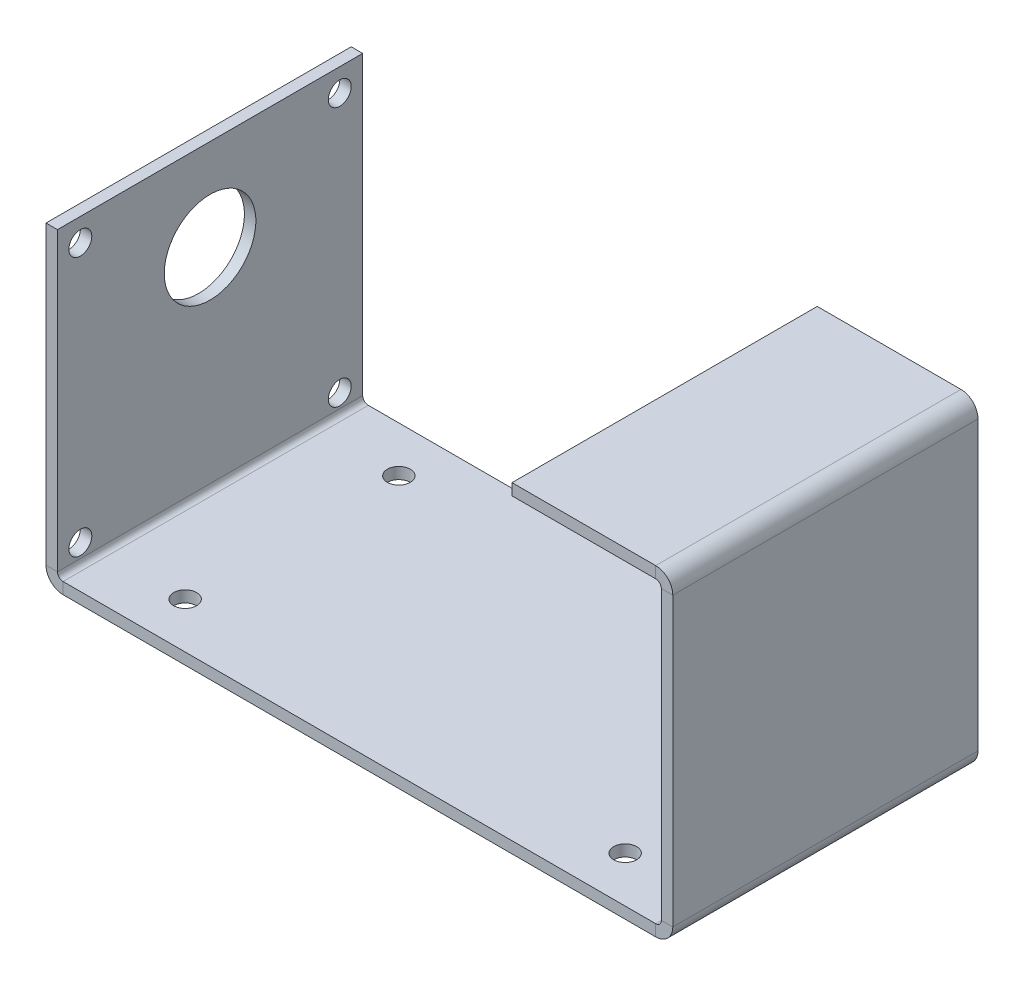
ISO-10303-21;
HEADER;
FILE_DESCRIPTION(('STEP AP214'),'2;1');
FILE_NAME('part.step','',(''),(''),'','','');
FILE_SCHEMA(('AUTOMOTIVE_DESIGN { 1 0 10303 214 1 1 1 1 }'));
ENDSEC;
DATA;
#1=APPLICATION_CONTEXT('core data for automotive mechanical design processes');
#2=APPLICATION_PROTOCOL_DEFINITION('international standard','automotive_design',2000,#1);
#3=PRODUCT_CONTEXT('',#1,'mechanical');
#4=PRODUCT('Part','Part','',(#3));
#5=PRODUCT_RELATED_PRODUCT_CATEGORY('part','',(#4));
#6=PRODUCT_DEFINITION_FORMATION('','',#4);
#7=PRODUCT_DEFINITION_CONTEXT('part definition',#1,'design');
#8=PRODUCT_DEFINITION('design','',#6,#7);
#9=PRODUCT_DEFINITION_SHAPE('','',#8);
#10=(LENGTH_UNIT() NAMED_UNIT(*) SI_UNIT(.MILLI.,.METRE.));
#11=(NAMED_UNIT(*) PLANE_ANGLE_UNIT() SI_UNIT($,.RADIAN.));
#12=(NAMED_UNIT(*) SI_UNIT($,.STERADIAN.) SOLID_ANGLE_UNIT());
#13=UNCERTAINTY_MEASURE_WITH_UNIT(LENGTH_MEASURE(1.E-05),#10,'distance_accuracy_value','');
#14=(GEOMETRIC_REPRESENTATION_CONTEXT(3) GLOBAL_UNCERTAINTY_ASSIGNED_CONTEXT((#13)) GLOBAL_UNIT_ASSIGNED_CONTEXT((#10,
#11,#12)) REPRESENTATION_CONTEXT('',''));
#15=CARTESIAN_POINT('',(0.,0.,0.));
#16=DIRECTION('',(0.,0.,1.));
#17=DIRECTION('',(1.,0.,0.));
#18=AXIS2_PLACEMENT_3D('',#15,#16,#17);
#19=CARTESIAN_POINT('',(121.069027090294,-120.430972909707,-40.));
#20=DIRECTION('',(0.,0.,-1.));
#21=DIRECTION('',(0.,-1.,0.));
#22=AXIS2_PLACEMENT_3D('',#19,#20,#21);
#23=PLANE('',#22);
#24=DIRECTION('',(0.,-1.,0.));
#25=VECTOR('',#24,1.);
#26=CARTESIAN_POINT('',(119.569027090294,-120.430972909707,-40.));
#27=LINE('',#26,#25);
#28=CARTESIAN_POINT('',(119.569027090293,38.4014541805867,-40.));
#29=VERTEX_POINT('',#28);
#30=CARTESIAN_POINT('',(119.569027090293,0.736600000000004,-40.));
#31=VERTEX_POINT('',#30);
#32=EDGE_CURVE('E87',#29,#31,#27,.T.);
#33=ORIENTED_EDGE('',*,*,#32,.F.);
#34=DIRECTION('',(1.,0.,0.));
#35=VECTOR('',#34,1.);
#36=CARTESIAN_POINT('',(121.069027090293,38.4014541805867,-40.));
#37=LINE('',#36,#35);
#38=CARTESIAN_POINT('',(121.069027090293,38.4014541805867,-40.));
#39=VERTEX_POINT('',#38);
#40=EDGE_CURVE('E358',#29,#39,#37,.T.);
#41=ORIENTED_EDGE('',*,*,#40,.T.);
#42=DIRECTION('',(0.,-1.,0.));
#43=VECTOR('',#42,1.);
#44=CARTESIAN_POINT('',(121.069027090293,39.5690270902934,-40.));
#45=LINE('',#44,#43);
#46=CARTESIAN_POINT('',(121.069027090293,0.736600000000004,-40.));
#47=VERTEX_POINT('',#46);
#48=EDGE_CURVE('E66',#39,#47,#45,.T.);
#49=ORIENTED_EDGE('',*,*,#48,.T.);
#50=DIRECTION('',(1.,0.,0.));
#51=VECTOR('',#50,1.);
#52=CARTESIAN_POINT('',(121.069027090293,0.736600000000004,-40.));
#53=LINE('',#52,#51);
#54=EDGE_CURVE('E352',#31,#47,#53,.T.);
#55=ORIENTED_EDGE('',*,*,#54,.F.);
#56=EDGE_LOOP('',(#33,#41,#49,#55));
#57=FACE_BOUND('',#56,.T.);
#58=ADVANCED_FACE('F62',(#57),#23,.T.);
#59=CARTESIAN_POINT('',(121.069027090293,39.5690270902934,0.));
#60=DIRECTION('',(0.,0.,1.));
#61=DIRECTION('',(0.,1.,0.));
#62=AXIS2_PLACEMENT_3D('',#59,#60,#61);
#63=PLANE('',#62);
#64=DIRECTION('',(0.,1.,0.));
#65=VECTOR('',#64,1.);
#66=CARTESIAN_POINT('',(121.069027090294,-120.430972909707,0.));
#67=LINE('',#66,#65);
#68=CARTESIAN_POINT('',(121.069027090293,0.736600000000007,0.));
#69=VERTEX_POINT('',#68);
#70=CARTESIAN_POINT('',(121.069027090293,38.4014541805867,0.));
#71=VERTEX_POINT('',#70);
#72=EDGE_CURVE('E362',#69,#71,#67,.T.);
#73=ORIENTED_EDGE('',*,*,#72,.T.);
#74=DIRECTION('',(-1.,0.,0.));
#75=VECTOR('',#74,1.);
#76=CARTESIAN_POINT('',(121.069027090293,38.4014541805867,0.));
#77=LINE('',#76,#75);
#78=CARTESIAN_POINT('',(119.569027090293,38.4014541805867,0.));
#79=VERTEX_POINT('',#78);
#80=EDGE_CURVE('E14',#71,#79,#77,.T.);
#81=ORIENTED_EDGE('',*,*,#80,.T.);
#82=DIRECTION('',(0.,1.,0.));
#83=VECTOR('',#82,1.);
#84=CARTESIAN_POINT('',(119.569027090293,39.5690270902934,0.));
#85=LINE('',#84,#83);
#86=CARTESIAN_POINT('',(119.569027090293,0.736600000000004,0.));
#87=VERTEX_POINT('',#86);
#88=EDGE_CURVE('E239',#87,#79,#85,.T.);
#89=ORIENTED_EDGE('',*,*,#88,.F.);
#90=DIRECTION('',(-1.,0.,0.));
#91=VECTOR('',#90,1.);
#92=CARTESIAN_POINT('',(121.069027090293,0.736600000000004,0.));
#93=LINE('',#92,#91);
#94=EDGE_CURVE('E347',#69,#87,#93,.T.);
#95=ORIENTED_EDGE('',*,*,#94,.F.);
#96=EDGE_LOOP('',(#73,#81,#89,#95));
#97=FACE_BOUND('',#96,.T.);
#98=ADVANCED_FACE('F64',(#97),#63,.T.);
#99=CARTESIAN_POINT('',(121.069027090294,-120.430972909707,0.));
#100=DIRECTION('',(1.,0.,0.));
#101=DIRECTION('',(0.,0.,-1.));
#102=AXIS2_PLACEMENT_3D('',#99,#100,#101);
#103=PLANE('',#102);
#104=ORIENTED_EDGE('',*,*,#48,.F.);
#105=DIRECTION('',(0.,0.,1.));
#106=VECTOR('',#105,1.);
#107=CARTESIAN_POINT('',(121.069027090293,38.4014541805867,0.));
#108=LINE('',#107,#106);
#109=EDGE_CURVE('E355',#39,#71,#108,.T.);
#110=ORIENTED_EDGE('',*,*,#109,.T.);
#111=ORIENTED_EDGE('',*,*,#72,.F.);
#112=DIRECTION('',(0.,0.,1.));
#113=VECTOR('',#112,1.);
#114=CARTESIAN_POINT('',(121.069027090293,0.736600000000004,0.));
#115=LINE('',#114,#113);
#116=EDGE_CURVE('E344',#47,#69,#115,.T.);
#117=ORIENTED_EDGE('',*,*,#116,.F.);
#118=EDGE_LOOP('',(#104,#110,#111,#117));
#119=FACE_BOUND('',#118,.T.);
#120=ADVANCED_FACE('F377',(#119),#103,.T.);
#121=CARTESIAN_POINT('',(119.569027090294,-120.430972909707,0.));
#122=DIRECTION('',(1.,0.,0.));
#123=DIRECTION('',(0.,0.,-1.));
#124=AXIS2_PLACEMENT_3D('',#121,#122,#123);
#125=PLANE('',#124);
#126=DIRECTION('',(0.,0.,1.));
#127=VECTOR('',#126,1.);
#128=CARTESIAN_POINT('',(119.569027090293,38.4014541805867,0.));
#129=LINE('',#128,#127);
#130=EDGE_CURVE('E71',#29,#79,#129,.T.);
#131=ORIENTED_EDGE('',*,*,#130,.F.);
#132=ORIENTED_EDGE('',*,*,#32,.T.);
#133=DIRECTION('',(0.,0.,1.));
#134=VECTOR('',#133,1.);
#135=CARTESIAN_POINT('',(119.569027090293,0.736600000000004,0.));
#136=LINE('',#135,#134);
#137=EDGE_CURVE('E350',#31,#87,#136,.T.);
#138=ORIENTED_EDGE('',*,*,#137,.T.);
#139=ORIENTED_EDGE('',*,*,#88,.T.);
#140=EDGE_LOOP('',(#131,#132,#138,#139));
#141=FACE_BOUND('',#140,.T.);
#142=ADVANCED_FACE('F366',(#141),#125,.F.);
#143=CARTESIAN_POINT('',(38.9309729097068,39.5690270902934,0.));
#144=DIRECTION('',(0.,1.,0.));
#145=DIRECTION('',(0.,0.,1.));
#146=AXIS2_PLACEMENT_3D('',#143,#144,#145);
#147=PLANE('',#146);
#148=DIRECTION('',(0.,0.,1.));
#149=VECTOR('',#148,1.);
#150=CARTESIAN_POINT('',(40.4309729097068,39.5690270902934,0.));
#151=LINE('',#150,#149);
#152=CARTESIAN_POINT('',(40.4309729097068,39.5690270902934,-40.));
#153=VERTEX_POINT('',#152);
#154=CARTESIAN_POINT('',(40.4309729097068,39.5690270902934,0.));
#155=VERTEX_POINT('',#154);
#156=EDGE_CURVE('E309',#153,#155,#151,.T.);
#157=ORIENTED_EDGE('',*,*,#156,.F.);
#158=DIRECTION('',(1.,0.,0.));
#159=VECTOR('',#158,1.);
#160=CARTESIAN_POINT('',(38.9309729097068,39.5690270902934,-40.));
#161=LINE('',#160,#159);
#162=CARTESIAN_POINT('',(38.9309729097068,39.5690270902934,-40.));
#163=VERTEX_POINT('',#162);
#164=EDGE_CURVE('E314',#163,#153,#161,.T.);
#165=ORIENTED_EDGE('',*,*,#164,.F.);
#166=DIRECTION('',(0.,0.,1.));
#167=VECTOR('',#166,1.);
#168=CARTESIAN_POINT('',(38.9309729097068,39.5690270902934,0.));
#169=LINE('',#168,#167);
#170=CARTESIAN_POINT('',(38.9309729097068,39.5690270902934,0.));
#171=VERTEX_POINT('',#170);
#172=EDGE_CURVE('E339',#163,#171,#169,.T.);
#173=ORIENTED_EDGE('',*,*,#172,.T.);
#174=DIRECTION('',(1.,0.,0.));
#175=VECTOR('',#174,1.);
#176=CARTESIAN_POINT('',(38.9309729097068,39.5690270902934,0.));
#177=LINE('',#176,#175);
#178=EDGE_CURVE('E336',#171,#155,#177,.T.);
#179=ORIENTED_EDGE('',*,*,#178,.T.);
#180=EDGE_LOOP('',(#157,#165,#173,#179));
#181=FACE_BOUND('',#180,.T.);
#182=ADVANCED_FACE('F481',(#181),#147,.T.);
#183=CARTESIAN_POINT('',(38.9309729097067,27.5690270902934,-20.));
#184=DIRECTION('',(1.,0.,0.));
#185=DIRECTION('',(0.,0.,1.));
#186=AXIS2_PLACEMENT_3D('',#183,#184,#185);
#187=CYLINDRICAL_SURFACE('',#186,5.99999999999999);
#188=CARTESIAN_POINT('',(38.9309729097067,27.5690270902934,-20.));
#189=DIRECTION('',(1.,0.,0.));
#190=DIRECTION('',(0.,0.,1.));
#191=AXIS2_PLACEMENT_3D('',#188,#189,#190);
#192=CIRCLE('',#191,5.99999999999999);
#193=CARTESIAN_POINT('',(38.9309729097067,27.5690270902934,-14.));
#194=VERTEX_POINT('',#193);
#195=EDGE_CURVE('E286',#194,#194,#192,.T.);
#196=ORIENTED_EDGE('',*,*,#195,.F.);
#197=EDGE_LOOP('',(#196));
#198=FACE_BOUND('',#197,.T.);
#199=CARTESIAN_POINT('',(40.4309729097068,27.5690270902934,-20.));
#200=DIRECTION('',(1.,0.,0.));
#201=DIRECTION('',(0.,0.,1.));
#202=AXIS2_PLACEMENT_3D('',#199,#200,#201);
#203=CIRCLE('',#202,5.99999999999999);
#204=CARTESIAN_POINT('',(40.4309729097068,27.5690270902934,-14.));
#205=VERTEX_POINT('',#204);
#206=EDGE_CURVE('E333',#205,#205,#203,.T.);
#207=ORIENTED_EDGE('',*,*,#206,.T.);
#208=EDGE_LOOP('',(#207));
#209=FACE_BOUND('',#208,.T.);
#210=ADVANCED_FACE('F483',(#198,#209),#187,.F.);
#211=CARTESIAN_POINT('',(38.9309729097068,36.5690270902934,-37.));
#212=DIRECTION('',(1.,0.,0.));
#213=DIRECTION('',(0.,0.,1.));
#214=AXIS2_PLACEMENT_3D('',#211,#212,#213);
#215=CYLINDRICAL_SURFACE('',#214,1.5);
#216=CARTESIAN_POINT('',(38.9309729097068,36.5690270902934,-37.));
#217=DIRECTION('',(1.,0.,0.));
#218=DIRECTION('',(0.,0.,1.));
#219=AXIS2_PLACEMENT_3D('',#216,#217,#218);
#220=CIRCLE('',#219,1.5);
#221=CARTESIAN_POINT('',(38.9309729097068,36.5690270902934,-35.5));
#222=VERTEX_POINT('',#221);
#223=EDGE_CURVE('E289',#222,#222,#220,.T.);
#224=ORIENTED_EDGE('',*,*,#223,.F.);
#225=EDGE_LOOP('',(#224));
#226=FACE_BOUND('',#225,.T.);
#227=CARTESIAN_POINT('',(40.4309729097068,36.5690270902934,-37.));
#228=DIRECTION('',(1.,0.,0.));
#229=DIRECTION('',(0.,0.,1.));
#230=AXIS2_PLACEMENT_3D('',#227,#228,#229);
#231=CIRCLE('',#230,1.5);
#232=CARTESIAN_POINT('',(40.4309729097068,36.5690270902934,-35.5));
#233=VERTEX_POINT('',#232);
#234=EDGE_CURVE('E330',#233,#233,#231,.T.);
#235=ORIENTED_EDGE('',*,*,#234,.T.);
#236=EDGE_LOOP('',(#235));
#237=FACE_BOUND('',#236,.T.);
#238=ADVANCED_FACE('F489',(#226,#237),#215,.F.);
#239=CARTESIAN_POINT('',(38.9309729097067,2.56902709029332,-37.0000000000004));
#240=DIRECTION('',(1.,0.,0.));
#241=DIRECTION('',(0.,0.,1.));
#242=AXIS2_PLACEMENT_3D('',#239,#240,#241);
#243=CYLINDRICAL_SURFACE('',#242,1.5);
#244=CARTESIAN_POINT('',(38.9309729097067,2.56902709029332,-37.0000000000004));
#245=DIRECTION('',(1.,0.,0.));
#246=DIRECTION('',(0.,0.,1.));
#247=AXIS2_PLACEMENT_3D('',#244,#245,#246);
#248=CIRCLE('',#247,1.5);
#249=CARTESIAN_POINT('',(38.9309729097067,2.56902709029332,-35.5000000000004));
#250=VERTEX_POINT('',#249);
#251=EDGE_CURVE('E292',#250,#250,#248,.T.);
#252=ORIENTED_EDGE('',*,*,#251,.F.);
#253=EDGE_LOOP('',(#252));
#254=FACE_BOUND('',#253,.T.);
#255=CARTESIAN_POINT('',(40.4309729097067,2.56902709029331,-37.0000000000004));
#256=DIRECTION('',(1.,0.,0.));
#257=DIRECTION('',(0.,0.,1.));
#258=AXIS2_PLACEMENT_3D('',#255,#256,#257);
#259=CIRCLE('',#258,1.5);
#260=CARTESIAN_POINT('',(40.4309729097067,2.56902709029331,-35.5000000000004));
#261=VERTEX_POINT('',#260);
#262=EDGE_CURVE('E327',#261,#261,#259,.T.);
#263=ORIENTED_EDGE('',*,*,#262,.T.);
#264=EDGE_LOOP('',(#263));
#265=FACE_BOUND('',#264,.T.);
#266=ADVANCED_FACE('F535',(#254,#265),#243,.F.);
#267=CARTESIAN_POINT('',(38.9309729097067,2.56902709029301,-3.00000000000036));
#268=DIRECTION('',(1.,0.,0.));
#269=DIRECTION('',(0.,0.,1.));
#270=AXIS2_PLACEMENT_3D('',#267,#268,#269);
#271=CYLINDRICAL_SURFACE('',#270,1.5);
#272=CARTESIAN_POINT('',(38.9309729097067,2.56902709029301,-3.00000000000036));
#273=DIRECTION('',(1.,0.,0.));
#274=DIRECTION('',(0.,0.,1.));
#275=AXIS2_PLACEMENT_3D('',#272,#273,#274);
#276=CIRCLE('',#275,1.5);
#277=CARTESIAN_POINT('',(38.9309729097067,2.56902709029301,-1.50000000000035));
#278=VERTEX_POINT('',#277);
#279=EDGE_CURVE('E295',#278,#278,#276,.T.);
#280=ORIENTED_EDGE('',*,*,#279,.F.);
#281=EDGE_LOOP('',(#280));
#282=FACE_BOUND('',#281,.T.);
#283=CARTESIAN_POINT('',(40.4309729097067,2.569027090293,-3.00000000000036));
#284=DIRECTION('',(1.,0.,0.));
#285=DIRECTION('',(0.,0.,1.));
#286=AXIS2_PLACEMENT_3D('',#283,#284,#285);
#287=CIRCLE('',#286,1.5);
#288=CARTESIAN_POINT('',(40.4309729097067,2.569027090293,-1.50000000000035));
#289=VERTEX_POINT('',#288);
#290=EDGE_CURVE('E324',#289,#289,#287,.T.);
#291=ORIENTED_EDGE('',*,*,#290,.T.);
#292=EDGE_LOOP('',(#291));
#293=FACE_BOUND('',#292,.T.);
#294=ADVANCED_FACE('F531',(#282,#293),#271,.F.);
#295=CARTESIAN_POINT('',(38.9309729097068,36.5690270902931,-3.00000000000018));
#296=DIRECTION('',(1.,0.,0.));
#297=DIRECTION('',(0.,0.,1.));
#298=AXIS2_PLACEMENT_3D('',#295,#296,#297);
#299=CYLINDRICAL_SURFACE('',#298,1.5);
#300=CARTESIAN_POINT('',(38.9309729097068,36.5690270902931,-3.00000000000018));
#301=DIRECTION('',(1.,0.,0.));
#302=DIRECTION('',(0.,0.,1.));
#303=AXIS2_PLACEMENT_3D('',#300,#301,#302);
#304=CIRCLE('',#303,1.5);
#305=CARTESIAN_POINT('',(38.9309729097068,36.5690270902931,-1.50000000000018));
#306=VERTEX_POINT('',#305);
#307=EDGE_CURVE('E298',#306,#306,#304,.T.);
#308=ORIENTED_EDGE('',*,*,#307,.F.);
#309=EDGE_LOOP('',(#308));
#310=FACE_BOUND('',#309,.T.);
#311=CARTESIAN_POINT('',(40.4309729097068,36.5690270902931,-3.00000000000018));
#312=DIRECTION('',(1.,0.,0.));
#313=DIRECTION('',(0.,0.,1.));
#314=AXIS2_PLACEMENT_3D('',#311,#312,#313);
#315=CIRCLE('',#314,1.5);
#316=CARTESIAN_POINT('',(40.4309729097068,36.5690270902931,-1.50000000000018));
#317=VERTEX_POINT('',#316);
#318=EDGE_CURVE('E321',#317,#317,#315,.T.);
#319=ORIENTED_EDGE('',*,*,#318,.T.);
#320=EDGE_LOOP('',(#319));
#321=FACE_BOUND('',#320,.T.);
#322=ADVANCED_FACE('F528',(#310,#321),#299,.F.);
#323=CARTESIAN_POINT('',(38.9309729097068,39.5690270902934,-40.));
#324=DIRECTION('',(0.,0.,-1.));
#325=DIRECTION('',(0.,1.,0.));
#326=AXIS2_PLACEMENT_3D('',#323,#324,#325);
#327=PLANE('',#326);
#328=DIRECTION('',(0.,1.,0.));
#329=VECTOR('',#328,1.);
#330=CARTESIAN_POINT('',(40.4309729097068,39.5690270902934,-40.));
#331=LINE('',#330,#329);
#332=CARTESIAN_POINT('',(40.4309729097067,0.736600000000004,-40.));
#333=VERTEX_POINT('',#332);
#334=EDGE_CURVE('E312',#333,#153,#331,.T.);
#335=ORIENTED_EDGE('',*,*,#334,.F.);
#336=DIRECTION('',(-1.,0.,0.));
#337=VECTOR('',#336,1.);
#338=CARTESIAN_POINT('',(38.9309729097067,0.736600000000011,-40.));
#339=LINE('',#338,#337);
#340=CARTESIAN_POINT('',(38.9309729097067,0.736600000000007,-40.));
#341=VERTEX_POINT('',#340);
#342=EDGE_CURVE('E319',#333,#341,#339,.T.);
#343=ORIENTED_EDGE('',*,*,#342,.T.);
#344=DIRECTION('',(0.,1.,0.));
#345=VECTOR('',#344,1.);
#346=CARTESIAN_POINT('',(38.9309729097062,-120.430972909707,-40.));
#347=LINE('',#346,#345);
#348=EDGE_CURVE('E317',#341,#163,#347,.T.);
#349=ORIENTED_EDGE('',*,*,#348,.T.);
#350=ORIENTED_EDGE('',*,*,#164,.T.);
#351=EDGE_LOOP('',(#335,#343,#349,#350));
#352=FACE_BOUND('',#351,.T.);
#353=ADVANCED_FACE('F459',(#352),#327,.T.);
#354=CARTESIAN_POINT('',(40.4309729097068,39.5690270902934,0.));
#355=DIRECTION('',(-1.,0.,0.));
#356=DIRECTION('',(0.,0.,-1.));
#357=AXIS2_PLACEMENT_3D('',#354,#355,#356);
#358=PLANE('',#357);
#359=DIRECTION('',(0.,0.,1.));
#360=VECTOR('',#359,1.);
#361=CARTESIAN_POINT('',(40.4309729097067,0.736600000000004,0.));
#362=LINE('',#361,#360);
#363=CARTESIAN_POINT('',(40.4309729097067,0.736600000000004,0.));
#364=VERTEX_POINT('',#363);
#365=EDGE_CURVE('E275',#333,#364,#362,.T.);
#366=ORIENTED_EDGE('',*,*,#365,.F.);
#367=ORIENTED_EDGE('',*,*,#334,.T.);
#368=ORIENTED_EDGE('',*,*,#156,.T.);
#369=DIRECTION('',(0.,-1.,0.));
#370=VECTOR('',#369,1.);
#371=CARTESIAN_POINT('',(40.4309729097062,-120.430972909707,0.));
#372=LINE('',#371,#370);
#373=EDGE_CURVE('E307',#155,#364,#372,.T.);
#374=ORIENTED_EDGE('',*,*,#373,.T.);
#375=EDGE_LOOP('',(#366,#367,#368,#374));
#376=FACE_BOUND('',#375,.T.);
#377=ORIENTED_EDGE('',*,*,#318,.F.);
#378=EDGE_LOOP('',(#377));
#379=FACE_BOUND('',#378,.T.);
#380=ORIENTED_EDGE('',*,*,#290,.F.);
#381=EDGE_LOOP('',(#380));
#382=FACE_BOUND('',#381,.T.);
#383=ORIENTED_EDGE('',*,*,#262,.F.);
#384=EDGE_LOOP('',(#383));
#385=FACE_BOUND('',#384,.T.);
#386=ORIENTED_EDGE('',*,*,#234,.F.);
#387=EDGE_LOOP('',(#386));
#388=FACE_BOUND('',#387,.T.);
#389=ORIENTED_EDGE('',*,*,#206,.F.);
#390=EDGE_LOOP('',(#389));
#391=FACE_BOUND('',#390,.T.);
#392=ADVANCED_FACE('F477',(#376,#379,#382,#385,#388,#391),#358,.F.);
#393=CARTESIAN_POINT('',(38.9309729097062,-120.430972909707,0.));
#394=DIRECTION('',(0.,0.,1.));
#395=DIRECTION('',(0.,-1.,0.));
#396=AXIS2_PLACEMENT_3D('',#393,#394,#395);
#397=PLANE('',#396);
#398=DIRECTION('',(0.,-1.,0.));
#399=VECTOR('',#398,1.);
#400=CARTESIAN_POINT('',(38.9309729097068,39.5690270902934,0.));
#401=LINE('',#400,#399);
#402=CARTESIAN_POINT('',(38.9309729097067,0.736600000000011,0.));
#403=VERTEX_POINT('',#402);
#404=EDGE_CURVE('E304',#171,#403,#401,.T.);
#405=ORIENTED_EDGE('',*,*,#404,.T.);
#406=DIRECTION('',(1.,0.,0.));
#407=VECTOR('',#406,1.);
#408=CARTESIAN_POINT('',(38.9309729097067,0.736600000000011,0.));
#409=LINE('',#408,#407);
#410=EDGE_CURVE('E301',#403,#364,#409,.T.);
#411=ORIENTED_EDGE('',*,*,#410,.T.);
#412=ORIENTED_EDGE('',*,*,#373,.F.);
#413=ORIENTED_EDGE('',*,*,#178,.F.);
#414=EDGE_LOOP('',(#405,#411,#412,#413));
#415=FACE_BOUND('',#414,.T.);
#416=ADVANCED_FACE('F475',(#415),#397,.T.);
#417=CARTESIAN_POINT('',(38.9309729097068,39.5690270902934,0.));
#418=DIRECTION('',(-1.,0.,0.));
#419=DIRECTION('',(0.,0.,-1.));
#420=AXIS2_PLACEMENT_3D('',#417,#418,#419);
#421=PLANE('',#420);
#422=ORIENTED_EDGE('',*,*,#307,.T.);
#423=EDGE_LOOP('',(#422));
#424=FACE_BOUND('',#423,.T.);
#425=ORIENTED_EDGE('',*,*,#279,.T.);
#426=EDGE_LOOP('',(#425));
#427=FACE_BOUND('',#426,.T.);
#428=ORIENTED_EDGE('',*,*,#251,.T.);
#429=EDGE_LOOP('',(#428));
#430=FACE_BOUND('',#429,.T.);
#431=ORIENTED_EDGE('',*,*,#223,.T.);
#432=EDGE_LOOP('',(#431));
#433=FACE_BOUND('',#432,.T.);
#434=ORIENTED_EDGE('',*,*,#195,.T.);
#435=EDGE_LOOP('',(#434));
#436=FACE_BOUND('',#435,.T.);
#437=ORIENTED_EDGE('',*,*,#348,.F.);
#438=DIRECTION('',(0.,0.,1.));
#439=VECTOR('',#438,1.);
#440=CARTESIAN_POINT('',(38.9309729097067,0.736600000000011,0.));
#441=LINE('',#440,#439);
#442=EDGE_CURVE('E284',#341,#403,#441,.T.);
#443=ORIENTED_EDGE('',*,*,#442,.T.);
#444=ORIENTED_EDGE('',*,*,#404,.F.);
#445=ORIENTED_EDGE('',*,*,#172,.F.);
#446=EDGE_LOOP('',(#437,#443,#444,#445));
#447=FACE_BOUND('',#446,.T.);
#448=ADVANCED_FACE('F465',(#424,#427,#430,#433,#436,#447),#421,.T.);
#449=CARTESIAN_POINT('',(41.1675729097067,0.7366,-40.));
#450=DIRECTION('',(0.,0.,-1.));
#451=DIRECTION('',(-1.,0.,0.));
#452=AXIS2_PLACEMENT_3D('',#449,#450,#451);
#453=PLANE('',#452);
#454=ORIENTED_EDGE('',*,*,#342,.F.);
#455=CARTESIAN_POINT('',(41.1675729097067,0.7366,-40.));
#456=DIRECTION('',(0.,0.,-1.));
#457=DIRECTION('',(-1.,0.,0.));
#458=AXIS2_PLACEMENT_3D('',#455,#456,#457);
#459=CIRCLE('',#458,0.7366);
#460=CARTESIAN_POINT('',(41.1675729097067,0.,-40.));
#461=VERTEX_POINT('',#460);
#462=EDGE_CURVE('E281',#333,#461,#459,.F.);
#463=ORIENTED_EDGE('',*,*,#462,.T.);
#464=DIRECTION('',(0.,-1.,0.));
#465=VECTOR('',#464,1.);
#466=CARTESIAN_POINT('',(41.1675729097067,-1.5,-40.));
#467=LINE('',#466,#465);
#468=CARTESIAN_POINT('',(41.1675729097067,-1.5,-40.));
#469=VERTEX_POINT('',#468);
#470=EDGE_CURVE('E278',#461,#469,#467,.T.);
#471=ORIENTED_EDGE('',*,*,#470,.T.);
#472=CARTESIAN_POINT('',(41.1675729097067,0.7366,-40.));
#473=DIRECTION('',(0.,0.,1.));
#474=DIRECTION('',(-1.,0.,0.));
#475=AXIS2_PLACEMENT_3D('',#472,#473,#474);
#476=CIRCLE('',#475,2.2366);
#477=EDGE_CURVE('E260',#341,#469,#476,.T.);
#478=ORIENTED_EDGE('',*,*,#477,.F.);
#479=EDGE_LOOP('',(#454,#463,#471,#478));
#480=FACE_BOUND('',#479,.T.);
#481=ADVANCED_FACE('F456',(#480),#453,.T.);
#482=CARTESIAN_POINT('',(41.1675729097067,0.7366,20.096170714894));
#483=DIRECTION('',(0.,0.,-1.));
#484=DIRECTION('',(-1.,0.,0.));
#485=AXIS2_PLACEMENT_3D('',#482,#483,#484);
#486=CYLINDRICAL_SURFACE('',#485,0.7366);
#487=DIRECTION('',(0.,0.,1.));
#488=VECTOR('',#487,1.);
#489=CARTESIAN_POINT('',(41.1675729097067,0.,0.));
#490=LINE('',#489,#488);
#491=CARTESIAN_POINT('',(41.1675729097067,0.,0.));
#492=VERTEX_POINT('',#491);
#493=EDGE_CURVE('E246',#461,#492,#490,.T.);
#494=ORIENTED_EDGE('',*,*,#493,.F.);
#495=ORIENTED_EDGE('',*,*,#462,.F.);
#496=ORIENTED_EDGE('',*,*,#365,.T.);
#497=CARTESIAN_POINT('',(41.1675729097067,0.7366,0.));
#498=DIRECTION('',(0.,0.,-1.));
#499=DIRECTION('',(-1.,0.,0.));
#500=AXIS2_PLACEMENT_3D('',#497,#498,#499);
#501=CIRCLE('',#500,0.7366);
#502=EDGE_CURVE('E272',#492,#364,#501,.T.);
#503=ORIENTED_EDGE('',*,*,#502,.F.);
#504=EDGE_LOOP('',(#494,#495,#496,#503));
#505=FACE_BOUND('',#504,.T.);
#506=ADVANCED_FACE('F454',(#505),#486,.F.);
#507=CARTESIAN_POINT('',(41.1675729097067,0.7366,0.));
#508=DIRECTION('',(0.,0.,1.));
#509=DIRECTION('',(1.,0.,0.));
#510=AXIS2_PLACEMENT_3D('',#507,#508,#509);
#511=PLANE('',#510);
#512=ORIENTED_EDGE('',*,*,#502,.T.);
#513=ORIENTED_EDGE('',*,*,#410,.F.);
#514=CARTESIAN_POINT('',(41.1675729097067,0.7366,0.));
#515=DIRECTION('',(0.,0.,-1.));
#516=DIRECTION('',(1.,0.,0.));
#517=AXIS2_PLACEMENT_3D('',#514,#515,#516);
#518=CIRCLE('',#517,2.2366);
#519=CARTESIAN_POINT('',(41.1675729097067,-1.5,0.));
#520=VERTEX_POINT('',#519);
#521=EDGE_CURVE('E263',#520,#403,#518,.T.);
#522=ORIENTED_EDGE('',*,*,#521,.F.);
#523=DIRECTION('',(0.,1.,0.));
#524=VECTOR('',#523,1.);
#525=CARTESIAN_POINT('',(41.1675729097067,-1.5,0.));
#526=LINE('',#525,#524);
#527=EDGE_CURVE('E269',#520,#492,#526,.T.);
#528=ORIENTED_EDGE('',*,*,#527,.T.);
#529=EDGE_LOOP('',(#512,#513,#522,#528));
#530=FACE_BOUND('',#529,.T.);
#531=ADVANCED_FACE('F472',(#530),#511,.T.);
#532=CARTESIAN_POINT('',(41.1675729097067,0.7366,20.096170714894));
#533=DIRECTION('',(0.,0.,-1.));
#534=DIRECTION('',(-1.,0.,0.));
#535=AXIS2_PLACEMENT_3D('',#532,#533,#534);
#536=CYLINDRICAL_SURFACE('',#535,2.2366);
#537=DIRECTION('',(0.,0.,1.));
#538=VECTOR('',#537,1.);
#539=CARTESIAN_POINT('',(41.1675729097067,-1.5,0.));
#540=LINE('',#539,#538);
#541=EDGE_CURVE('E266',#469,#520,#540,.T.);
#542=ORIENTED_EDGE('',*,*,#541,.T.);
#543=ORIENTED_EDGE('',*,*,#521,.T.);
#544=ORIENTED_EDGE('',*,*,#442,.F.);
#545=ORIENTED_EDGE('',*,*,#477,.T.);
#546=EDGE_LOOP('',(#542,#543,#544,#545));
#547=FACE_BOUND('',#546,.T.);
#548=ADVANCED_FACE('F468',(#547),#536,.T.);
#549=CARTESIAN_POINT('',(0.,-1.5,0.));
#550=DIRECTION('',(0.,-1.,0.));
#551=DIRECTION('',(0.,0.,-1.));
#552=AXIS2_PLACEMENT_3D('',#549,#550,#551);
#553=PLANE('',#552);
#554=CARTESIAN_POINT('',(108.832427090293,-1.5,-34.));
#555=DIRECTION('',(0.,1.,0.));
#556=DIRECTION('',(0.,0.,1.));
#557=AXIS2_PLACEMENT_3D('',#554,#555,#556);
#558=CIRCLE('',#557,1.5);
#559=CARTESIAN_POINT('',(108.832427090293,-1.5,-32.5));
#560=VERTEX_POINT('',#559);
#561=EDGE_CURVE('E417',#560,#560,#558,.T.);
#562=ORIENTED_EDGE('',*,*,#561,.T.);
#563=EDGE_LOOP('',(#562));
#564=FACE_BOUND('',#563,.T.);
#565=CARTESIAN_POINT('',(108.832427090293,-1.5,-6.));
#566=DIRECTION('',(0.,1.,0.));
#567=DIRECTION('',(0.,0.,1.));
#568=AXIS2_PLACEMENT_3D('',#565,#566,#567);
#569=CIRCLE('',#568,1.5);
#570=CARTESIAN_POINT('',(108.832427090293,-1.5,-4.5));
#571=VERTEX_POINT('',#570);
#572=EDGE_CURVE('E411',#571,#571,#569,.T.);
#573=ORIENTED_EDGE('',*,*,#572,.T.);
#574=EDGE_LOOP('',(#573));
#575=FACE_BOUND('',#574,.T.);
#576=CARTESIAN_POINT('',(51.1675729097067,-1.5,-6.));
#577=DIRECTION('',(0.,1.,0.));
#578=DIRECTION('',(0.,0.,1.));
#579=AXIS2_PLACEMENT_3D('',#576,#577,#578);
#580=CIRCLE('',#579,1.5);
#581=CARTESIAN_POINT('',(51.1675729097067,-1.5,-4.5));
#582=VERTEX_POINT('',#581);
#583=EDGE_CURVE('E405',#582,#582,#580,.T.);
#584=ORIENTED_EDGE('',*,*,#583,.T.);
#585=EDGE_LOOP('',(#584));
#586=FACE_BOUND('',#585,.T.);
#587=CARTESIAN_POINT('',(51.1675729097067,-1.5,-34.));
#588=DIRECTION('',(0.,1.,0.));
#589=DIRECTION('',(0.,0.,1.));
#590=AXIS2_PLACEMENT_3D('',#587,#588,#589);
#591=CIRCLE('',#590,1.5);
#592=CARTESIAN_POINT('',(51.1675729097067,-1.5,-32.5));
#593=VERTEX_POINT('',#592);
#594=EDGE_CURVE('E214',#593,#593,#591,.T.);
#595=ORIENTED_EDGE('',*,*,#594,.T.);
#596=EDGE_LOOP('',(#595));
#597=FACE_BOUND('',#596,.T.);
#598=DIRECTION('',(-1.,0.,0.));
#599=VECTOR('',#598,1.);
#600=CARTESIAN_POINT('',(160.,-1.5,-40.));
#601=LINE('',#600,#599);
#602=CARTESIAN_POINT('',(118.832427090293,-1.5,-40.));
#603=VERTEX_POINT('',#602);
#604=EDGE_CURVE('E236',#603,#469,#601,.T.);
#605=ORIENTED_EDGE('',*,*,#604,.F.);
#606=DIRECTION('',(0.,0.,1.));
#607=VECTOR('',#606,1.);
#608=CARTESIAN_POINT('',(118.832427090293,-1.5,0.));
#609=LINE('',#608,#607);
#610=CARTESIAN_POINT('',(118.832427090293,-1.5,0.));
#611=VERTEX_POINT('',#610);
#612=EDGE_CURVE('E257',#603,#611,#609,.T.);
#613=ORIENTED_EDGE('',*,*,#612,.T.);
#614=DIRECTION('',(1.,0.,0.));
#615=VECTOR('',#614,1.);
#616=CARTESIAN_POINT('',(0.,-1.5,0.));
#617=LINE('',#616,#615);
#618=EDGE_CURVE('E254',#520,#611,#617,.T.);
#619=ORIENTED_EDGE('',*,*,#618,.F.);
#620=ORIENTED_EDGE('',*,*,#541,.F.);
#621=EDGE_LOOP('',(#605,#613,#619,#620));
#622=FACE_BOUND('',#621,.T.);
#623=ADVANCED_FACE('F506',(#564,#575,#586,#597,#622),#553,.T.);
#624=CARTESIAN_POINT('',(160.,-1.5,0.));
#625=DIRECTION('',(0.,0.,1.));
#626=DIRECTION('',(1.,0.,0.));
#627=AXIS2_PLACEMENT_3D('',#624,#625,#626);
#628=PLANE('',#627);
#629=ORIENTED_EDGE('',*,*,#618,.T.);
#630=DIRECTION('',(0.,1.,0.));
#631=VECTOR('',#630,1.);
#632=CARTESIAN_POINT('',(118.832427090293,-1.5,0.));
#633=LINE('',#632,#631);
#634=CARTESIAN_POINT('',(118.832427090293,0.,0.));
#635=VERTEX_POINT('',#634);
#636=EDGE_CURVE('E251',#611,#635,#633,.T.);
#637=ORIENTED_EDGE('',*,*,#636,.T.);
#638=DIRECTION('',(1.,0.,0.));
#639=VECTOR('',#638,1.);
#640=CARTESIAN_POINT('',(160.,0.,0.));
#641=LINE('',#640,#639);
#642=EDGE_CURVE('E243',#492,#635,#641,.T.);
#643=ORIENTED_EDGE('',*,*,#642,.F.);
#644=ORIENTED_EDGE('',*,*,#527,.F.);
#645=EDGE_LOOP('',(#629,#637,#643,#644));
#646=FACE_BOUND('',#645,.T.);
#647=ADVANCED_FACE('F430',(#646),#628,.T.);
#648=CARTESIAN_POINT('',(0.,0.,0.));
#649=DIRECTION('',(0.,-1.,0.));
#650=DIRECTION('',(0.,0.,-1.));
#651=AXIS2_PLACEMENT_3D('',#648,#649,#650);
#652=PLANE('',#651);
#653=CARTESIAN_POINT('',(108.832427090293,0.,-34.));
#654=DIRECTION('',(0.,1.,0.));
#655=DIRECTION('',(0.,0.,1.));
#656=AXIS2_PLACEMENT_3D('',#653,#654,#655);
#657=CIRCLE('',#656,1.49999999999999);
#658=CARTESIAN_POINT('',(108.832427090293,0.,-32.5));
#659=VERTEX_POINT('',#658);
#660=EDGE_CURVE('E420',#659,#659,#657,.T.);
#661=ORIENTED_EDGE('',*,*,#660,.F.);
#662=EDGE_LOOP('',(#661));
#663=FACE_BOUND('',#662,.T.);
#664=CARTESIAN_POINT('',(108.832427090293,0.,-6.));
#665=DIRECTION('',(0.,1.,0.));
#666=DIRECTION('',(0.,0.,1.));
#667=AXIS2_PLACEMENT_3D('',#664,#665,#666);
#668=CIRCLE('',#667,1.49999999999999);
#669=CARTESIAN_POINT('',(108.832427090293,0.,-4.50000000000001));
#670=VERTEX_POINT('',#669);
#671=EDGE_CURVE('E414',#670,#670,#668,.T.);
#672=ORIENTED_EDGE('',*,*,#671,.F.);
#673=EDGE_LOOP('',(#672));
#674=FACE_BOUND('',#673,.T.);
#675=CARTESIAN_POINT('',(51.1675729097067,0.,-6.));
#676=DIRECTION('',(0.,1.,0.));
#677=DIRECTION('',(0.,0.,1.));
#678=AXIS2_PLACEMENT_3D('',#675,#676,#677);
#679=CIRCLE('',#678,1.49999999999999);
#680=CARTESIAN_POINT('',(51.1675729097067,0.,-4.50000000000001));
#681=VERTEX_POINT('',#680);
#682=EDGE_CURVE('E408',#681,#681,#679,.T.);
#683=ORIENTED_EDGE('',*,*,#682,.F.);
#684=EDGE_LOOP('',(#683));
#685=FACE_BOUND('',#684,.T.);
#686=CARTESIAN_POINT('',(51.1675729097067,0.,-34.));
#687=DIRECTION('',(0.,1.,0.));
#688=DIRECTION('',(0.,0.,1.));
#689=AXIS2_PLACEMENT_3D('',#686,#687,#688);
#690=CIRCLE('',#689,1.49999999999999);
#691=CARTESIAN_POINT('',(51.1675729097067,0.,-32.5));
#692=VERTEX_POINT('',#691);
#693=EDGE_CURVE('E402',#692,#692,#690,.T.);
#694=ORIENTED_EDGE('',*,*,#693,.F.);
#695=EDGE_LOOP('',(#694));
#696=FACE_BOUND('',#695,.T.);
#697=DIRECTION('',(0.,0.,1.));
#698=VECTOR('',#697,1.);
#699=CARTESIAN_POINT('',(118.832427090293,0.,0.));
#700=LINE('',#699,#698);
#701=CARTESIAN_POINT('',(118.832427090293,0.,-40.));
#702=VERTEX_POINT('',#701);
#703=EDGE_CURVE('E232',#702,#635,#700,.T.);
#704=ORIENTED_EDGE('',*,*,#703,.F.);
#705=DIRECTION('',(-1.,0.,0.));
#706=VECTOR('',#705,1.);
#707=CARTESIAN_POINT('',(0.,0.,-40.));
#708=LINE('',#707,#706);
#709=EDGE_CURVE('E249',#702,#461,#708,.T.);
#710=ORIENTED_EDGE('',*,*,#709,.T.);
#711=ORIENTED_EDGE('',*,*,#493,.T.);
#712=ORIENTED_EDGE('',*,*,#642,.T.);
#713=EDGE_LOOP('',(#704,#710,#711,#712));
#714=FACE_BOUND('',#713,.T.);
#715=ADVANCED_FACE('F426',(#663,#674,#685,#696,#714),#652,.F.);
#716=CARTESIAN_POINT('',(0.,-1.5,-40.));
#717=DIRECTION('',(0.,0.,-1.));
#718=DIRECTION('',(-1.,0.,0.));
#719=AXIS2_PLACEMENT_3D('',#716,#717,#718);
#720=PLANE('',#719);
#721=ORIENTED_EDGE('',*,*,#709,.F.);
#722=DIRECTION('',(0.,-1.,0.));
#723=VECTOR('',#722,1.);
#724=CARTESIAN_POINT('',(118.832427090293,-1.5,-40.));
#725=LINE('',#724,#723);
#726=EDGE_CURVE('E240',#702,#603,#725,.T.);
#727=ORIENTED_EDGE('',*,*,#726,.T.);
#728=ORIENTED_EDGE('',*,*,#604,.T.);
#729=ORIENTED_EDGE('',*,*,#470,.F.);
#730=EDGE_LOOP('',(#721,#727,#728,#729));
#731=FACE_BOUND('',#730,.T.);
#732=ADVANCED_FACE('F429',(#731),#720,.T.);
#733=CARTESIAN_POINT('',(118.832427090293,0.7366,-40.));
#734=DIRECTION('',(0.,0.,-1.));
#735=DIRECTION('',(-1.,0.,0.));
#736=AXIS2_PLACEMENT_3D('',#733,#734,#735);
#737=PLANE('',#736);
#738=ORIENTED_EDGE('',*,*,#726,.F.);
#739=CARTESIAN_POINT('',(118.832427090293,0.7366,-40.));
#740=DIRECTION('',(0.,0.,1.));
#741=DIRECTION('',(1.,0.,0.));
#742=AXIS2_PLACEMENT_3D('',#739,#740,#741);
#743=CIRCLE('',#742,0.7366);
#744=EDGE_CURVE('E221',#702,#31,#743,.T.);
#745=ORIENTED_EDGE('',*,*,#744,.T.);
#746=ORIENTED_EDGE('',*,*,#54,.T.);
#747=CARTESIAN_POINT('',(118.832427090293,0.7366,-40.));
#748=DIRECTION('',(0.,0.,1.));
#749=DIRECTION('',(-1.,0.,0.));
#750=AXIS2_PLACEMENT_3D('',#747,#748,#749);
#751=CIRCLE('',#750,2.2366);
#752=EDGE_CURVE('E225',#603,#47,#751,.T.);
#753=ORIENTED_EDGE('',*,*,#752,.F.);
#754=EDGE_LOOP('',(#738,#745,#746,#753));
#755=FACE_BOUND('',#754,.T.);
#756=ADVANCED_FACE('F502',(#755),#737,.T.);
#757=CARTESIAN_POINT('',(118.832427090293,0.7366,0.));
#758=DIRECTION('',(0.,0.,1.));
#759=DIRECTION('',(1.,0.,0.));
#760=AXIS2_PLACEMENT_3D('',#757,#758,#759);
#761=PLANE('',#760);
#762=CARTESIAN_POINT('',(118.832427090293,0.7366,0.));
#763=DIRECTION('',(0.,0.,1.));
#764=DIRECTION('',(1.,0.,0.));
#765=AXIS2_PLACEMENT_3D('',#762,#763,#764);
#766=CIRCLE('',#765,0.7366);
#767=EDGE_CURVE('E229',#87,#635,#766,.F.);
#768=ORIENTED_EDGE('',*,*,#767,.T.);
#769=ORIENTED_EDGE('',*,*,#636,.F.);
#770=CARTESIAN_POINT('',(118.832427090293,0.7366,0.));
#771=DIRECTION('',(0.,0.,-1.));
#772=DIRECTION('',(1.,0.,0.));
#773=AXIS2_PLACEMENT_3D('',#770,#771,#772);
#774=CIRCLE('',#773,2.2366);
#775=EDGE_CURVE('E228',#69,#611,#774,.T.);
#776=ORIENTED_EDGE('',*,*,#775,.F.);
#777=ORIENTED_EDGE('',*,*,#94,.T.);
#778=EDGE_LOOP('',(#768,#769,#776,#777));
#779=FACE_BOUND('',#778,.T.);
#780=ADVANCED_FACE('F632',(#779),#761,.T.);
#781=CARTESIAN_POINT('',(118.832427090293,0.7366,-60.096170714894));
#782=DIRECTION('',(0.,0.,1.));
#783=DIRECTION('',(1.,0.,0.));
#784=AXIS2_PLACEMENT_3D('',#781,#782,#783);
#785=CYLINDRICAL_SURFACE('',#784,2.2366);
#786=ORIENTED_EDGE('',*,*,#116,.T.);
#787=ORIENTED_EDGE('',*,*,#775,.T.);
#788=ORIENTED_EDGE('',*,*,#612,.F.);
#789=ORIENTED_EDGE('',*,*,#752,.T.);
#790=EDGE_LOOP('',(#786,#787,#788,#789));
#791=FACE_BOUND('',#790,.T.);
#792=ADVANCED_FACE('F639',(#791),#785,.T.);
#793=CARTESIAN_POINT('',(118.832427090293,0.7366,-60.096170714894));
#794=DIRECTION('',(0.,0.,1.));
#795=DIRECTION('',(1.,0.,0.));
#796=AXIS2_PLACEMENT_3D('',#793,#794,#795);
#797=CYLINDRICAL_SURFACE('',#796,0.7366);
#798=ORIENTED_EDGE('',*,*,#137,.F.);
#799=ORIENTED_EDGE('',*,*,#744,.F.);
#800=ORIENTED_EDGE('',*,*,#703,.T.);
#801=ORIENTED_EDGE('',*,*,#767,.F.);
#802=EDGE_LOOP('',(#798,#799,#800,#801));
#803=FACE_BOUND('',#802,.T.);
#804=ADVANCED_FACE('F444',(#803),#797,.F.);
#805=CARTESIAN_POINT('',(118.832427090293,38.4014541805867,-40.));
#806=DIRECTION('',(0.,0.,-1.));
#807=DIRECTION('',(-1.,0.,0.));
#808=AXIS2_PLACEMENT_3D('',#805,#806,#807);
#809=PLANE('',#808);
#810=ORIENTED_EDGE('',*,*,#40,.F.);
#811=CARTESIAN_POINT('',(118.832427090293,38.4014541805867,-40.));
#812=DIRECTION('',(0.,0.,1.));
#813=DIRECTION('',(1.,0.,0.));
#814=AXIS2_PLACEMENT_3D('',#811,#812,#813);
#815=CIRCLE('',#814,0.7366);
#816=CARTESIAN_POINT('',(118.832427090293,39.1380541805867,-40.));
#817=VERTEX_POINT('',#816);
#818=EDGE_CURVE('E197',#29,#817,#815,.T.);
#819=ORIENTED_EDGE('',*,*,#818,.T.);
#820=DIRECTION('',(0.,1.,0.));
#821=VECTOR('',#820,1.);
#822=CARTESIAN_POINT('',(118.832427090293,40.6380541805867,-40.));
#823=LINE('',#822,#821);
#824=CARTESIAN_POINT('',(118.832427090293,40.6380541805867,-40.));
#825=VERTEX_POINT('',#824);
#826=EDGE_CURVE('E204',#817,#825,#823,.T.);
#827=ORIENTED_EDGE('',*,*,#826,.T.);
#828=CARTESIAN_POINT('',(118.832427090293,38.4014541805867,-40.));
#829=DIRECTION('',(0.,0.,1.));
#830=DIRECTION('',(-1.,0.,0.));
#831=AXIS2_PLACEMENT_3D('',#828,#829,#830);
#832=CIRCLE('',#831,2.2366);
#833=EDGE_CURVE('E215',#39,#825,#832,.T.);
#834=ORIENTED_EDGE('',*,*,#833,.F.);
#835=EDGE_LOOP('',(#810,#819,#827,#834));
#836=FACE_BOUND('',#835,.T.);
#837=ADVANCED_FACE('F382',(#836),#809,.T.);
#838=CARTESIAN_POINT('',(118.832427090293,38.4014541805867,0.));
#839=DIRECTION('',(0.,0.,1.));
#840=DIRECTION('',(1.,0.,0.));
#841=AXIS2_PLACEMENT_3D('',#838,#839,#840);
#842=PLANE('',#841);
#843=CARTESIAN_POINT('',(118.832427090293,38.4014541805867,0.));
#844=DIRECTION('',(0.,0.,1.));
#845=DIRECTION('',(1.,0.,0.));
#846=AXIS2_PLACEMENT_3D('',#843,#844,#845);
#847=CIRCLE('',#846,0.7366);
#848=CARTESIAN_POINT('',(118.832427090293,39.1380541805867,0.));
#849=VERTEX_POINT('',#848);
#850=EDGE_CURVE('E79',#849,#79,#847,.F.);
#851=ORIENTED_EDGE('',*,*,#850,.T.);
#852=ORIENTED_EDGE('',*,*,#80,.F.);
#853=CARTESIAN_POINT('',(118.832427090293,38.4014541805867,0.));
#854=DIRECTION('',(0.,0.,-1.));
#855=DIRECTION('',(1.,0.,0.));
#856=AXIS2_PLACEMENT_3D('',#853,#854,#855);
#857=CIRCLE('',#856,2.2366);
#858=CARTESIAN_POINT('',(118.832427090293,40.6380541805867,0.));
#859=VERTEX_POINT('',#858);
#860=EDGE_CURVE('E218',#859,#71,#857,.T.);
#861=ORIENTED_EDGE('',*,*,#860,.F.);
#862=DIRECTION('',(0.,-1.,0.));
#863=VECTOR('',#862,1.);
#864=CARTESIAN_POINT('',(118.832427090293,40.6380541805867,0.));
#865=LINE('',#864,#863);
#866=EDGE_CURVE('E185',#859,#849,#865,.T.);
#867=ORIENTED_EDGE('',*,*,#866,.T.);
#868=EDGE_LOOP('',(#851,#852,#861,#867));
#869=FACE_BOUND('',#868,.T.);
#870=ADVANCED_FACE('F371',(#869),#842,.T.);
#871=CARTESIAN_POINT('',(118.832427090293,38.4014541805867,-60.096170714894));
#872=DIRECTION('',(0.,0.,1.));
#873=DIRECTION('',(1.,0.,0.));
#874=AXIS2_PLACEMENT_3D('',#871,#872,#873);
#875=CYLINDRICAL_SURFACE('',#874,2.2366);
#876=DIRECTION('',(0.,0.,1.));
#877=VECTOR('',#876,1.);
#878=CARTESIAN_POINT('',(118.832427090293,40.6380541805867,0.));
#879=LINE('',#878,#877);
#880=EDGE_CURVE('E212',#825,#859,#879,.T.);
#881=ORIENTED_EDGE('',*,*,#880,.T.);
#882=ORIENTED_EDGE('',*,*,#860,.T.);
#883=ORIENTED_EDGE('',*,*,#109,.F.);
#884=ORIENTED_EDGE('',*,*,#833,.T.);
#885=EDGE_LOOP('',(#881,#882,#883,#884));
#886=FACE_BOUND('',#885,.T.);
#887=ADVANCED_FACE('F373',(#886),#875,.T.);
#888=CARTESIAN_POINT('',(118.832427090293,38.4014541805867,-60.096170714894));
#889=DIRECTION('',(0.,0.,1.));
#890=DIRECTION('',(1.,0.,0.));
#891=AXIS2_PLACEMENT_3D('',#888,#889,#890);
#892=CYLINDRICAL_SURFACE('',#891,0.7366);
#893=DIRECTION('',(0.,0.,1.));
#894=VECTOR('',#893,1.);
#895=CARTESIAN_POINT('',(118.832427090293,39.1380541805867,0.));
#896=LINE('',#895,#894);
#897=EDGE_CURVE('E387',#817,#849,#896,.T.);
#898=ORIENTED_EDGE('',*,*,#897,.F.);
#899=ORIENTED_EDGE('',*,*,#818,.F.);
#900=ORIENTED_EDGE('',*,*,#130,.T.);
#901=ORIENTED_EDGE('',*,*,#850,.F.);
#902=EDGE_LOOP('',(#898,#899,#900,#901));
#903=FACE_BOUND('',#902,.T.);
#904=ADVANCED_FACE('F385',(#903),#892,.F.);
#905=CARTESIAN_POINT('',(99.9999999999999,40.6380541805866,0.));
#906=DIRECTION('',(-1.,0.,0.));
#907=DIRECTION('',(0.,0.,-1.));
#908=AXIS2_PLACEMENT_3D('',#905,#906,#907);
#909=PLANE('',#908);
#910=DIRECTION('',(0.,0.,-1.));
#911=VECTOR('',#910,1.);
#912=CARTESIAN_POINT('',(99.9999999999999,39.1380541805866,0.));
#913=LINE('',#912,#911);
#914=CARTESIAN_POINT('',(99.9999999999999,39.1380541805866,0.));
#915=VERTEX_POINT('',#914);
#916=CARTESIAN_POINT('',(99.9999999999999,39.1380541805866,-40.));
#917=VERTEX_POINT('',#916);
#918=EDGE_CURVE('E189',#915,#917,#913,.T.);
#919=ORIENTED_EDGE('',*,*,#918,.F.);
#920=DIRECTION('',(0.,-1.,0.));
#921=VECTOR('',#920,1.);
#922=CARTESIAN_POINT('',(99.9999999999999,40.6380541805866,0.));
#923=LINE('',#922,#921);
#924=CARTESIAN_POINT('',(99.9999999999999,40.6380541805866,0.));
#925=VERTEX_POINT('',#924);
#926=EDGE_CURVE('E183',#925,#915,#923,.T.);
#927=ORIENTED_EDGE('',*,*,#926,.F.);
#928=DIRECTION('',(0.,0.,-1.));
#929=VECTOR('',#928,1.);
#930=CARTESIAN_POINT('',(99.9999999999999,40.6380541805866,0.));
#931=LINE('',#930,#929);
#932=CARTESIAN_POINT('',(99.9999999999999,40.6380541805866,-40.));
#933=VERTEX_POINT('',#932);
#934=EDGE_CURVE('E195',#925,#933,#931,.T.);
#935=ORIENTED_EDGE('',*,*,#934,.T.);
#936=DIRECTION('',(0.,-1.,0.));
#937=VECTOR('',#936,1.);
#938=CARTESIAN_POINT('',(99.9999999999999,40.6380541805866,-40.));
#939=LINE('',#938,#937);
#940=EDGE_CURVE('E203',#933,#917,#939,.T.);
#941=ORIENTED_EDGE('',*,*,#940,.T.);
#942=EDGE_LOOP('',(#919,#927,#935,#941));
#943=FACE_BOUND('',#942,.T.);
#944=ADVANCED_FACE('F193',(#943),#909,.T.);
#945=CARTESIAN_POINT('',(280.,40.6380541805878,0.));
#946=DIRECTION('',(0.,1.,0.));
#947=DIRECTION('',(0.,0.,-1.));
#948=AXIS2_PLACEMENT_3D('',#945,#946,#947);
#949=PLANE('',#948);
#950=ORIENTED_EDGE('',*,*,#880,.F.);
#951=DIRECTION('',(1.,0.,0.));
#952=VECTOR('',#951,1.);
#953=CARTESIAN_POINT('',(120.,40.6380541805867,-40.));
#954=LINE('',#953,#952);
#955=EDGE_CURVE('E202',#933,#825,#954,.T.);
#956=ORIENTED_EDGE('',*,*,#955,.F.);
#957=ORIENTED_EDGE('',*,*,#934,.F.);
#958=DIRECTION('',(-1.,0.,0.));
#959=VECTOR('',#958,1.);
#960=CARTESIAN_POINT('',(280.,40.6380541805878,0.));
#961=LINE('',#960,#959);
#962=EDGE_CURVE('E180',#859,#925,#961,.T.);
#963=ORIENTED_EDGE('',*,*,#962,.F.);
#964=EDGE_LOOP('',(#950,#956,#957,#963));
#965=FACE_BOUND('',#964,.T.);
#966=ADVANCED_FACE('F200',(#965),#949,.T.);
#967=CARTESIAN_POINT('',(280.,40.6380541805878,-40.));
#968=DIRECTION('',(0.,0.,-1.));
#969=DIRECTION('',(1.,0.,0.));
#970=AXIS2_PLACEMENT_3D('',#967,#968,#969);
#971=PLANE('',#970);
#972=ORIENTED_EDGE('',*,*,#826,.F.);
#973=DIRECTION('',(1.,0.,0.));
#974=VECTOR('',#973,1.);
#975=CARTESIAN_POINT('',(280.,39.1380541805878,-40.));
#976=LINE('',#975,#974);
#977=EDGE_CURVE('E390',#917,#817,#976,.T.);
#978=ORIENTED_EDGE('',*,*,#977,.F.);
#979=ORIENTED_EDGE('',*,*,#940,.F.);
#980=ORIENTED_EDGE('',*,*,#955,.T.);
#981=EDGE_LOOP('',(#972,#978,#979,#980));
#982=FACE_BOUND('',#981,.T.);
#983=ADVANCED_FACE('F397',(#982),#971,.T.);
#984=CARTESIAN_POINT('',(280.,39.1380541805878,0.));
#985=DIRECTION('',(0.,1.,0.));
#986=DIRECTION('',(0.,0.,-1.));
#987=AXIS2_PLACEMENT_3D('',#984,#985,#986);
#988=PLANE('',#987);
#989=ORIENTED_EDGE('',*,*,#977,.T.);
#990=ORIENTED_EDGE('',*,*,#897,.T.);
#991=DIRECTION('',(-1.,0.,0.));
#992=VECTOR('',#991,1.);
#993=CARTESIAN_POINT('',(120.,39.1380541805867,0.));
#994=LINE('',#993,#992);
#995=EDGE_CURVE('E389',#849,#915,#994,.T.);
#996=ORIENTED_EDGE('',*,*,#995,.T.);
#997=ORIENTED_EDGE('',*,*,#918,.T.);
#998=EDGE_LOOP('',(#989,#990,#996,#997));
#999=FACE_BOUND('',#998,.T.);
#1000=ADVANCED_FACE('F398',(#999),#988,.F.);
#1001=CARTESIAN_POINT('',(120.,40.6380541805867,0.));
#1002=DIRECTION('',(0.,0.,1.));
#1003=DIRECTION('',(-1.,0.,0.));
#1004=AXIS2_PLACEMENT_3D('',#1001,#1002,#1003);
#1005=PLANE('',#1004);
#1006=ORIENTED_EDGE('',*,*,#866,.F.);
#1007=ORIENTED_EDGE('',*,*,#962,.T.);
#1008=ORIENTED_EDGE('',*,*,#926,.T.);
#1009=ORIENTED_EDGE('',*,*,#995,.F.);
#1010=EDGE_LOOP('',(#1006,#1007,#1008,#1009));
#1011=FACE_BOUND('',#1010,.T.);
#1012=ADVANCED_FACE('F182',(#1011),#1005,.T.);
#1013=CARTESIAN_POINT('',(51.1675729097067,0.,-34.));
#1014=DIRECTION('',(0.,1.,0.));
#1015=DIRECTION('',(0.,0.,1.));
#1016=AXIS2_PLACEMENT_3D('',#1013,#1014,#1015);
#1017=CYLINDRICAL_SURFACE('',#1016,1.49999999999999);
#1018=ORIENTED_EDGE('',*,*,#594,.F.);
#1019=EDGE_LOOP('',(#1018));
#1020=FACE_BOUND('',#1019,.T.);
#1021=ORIENTED_EDGE('',*,*,#693,.T.);
#1022=EDGE_LOOP('',(#1021));
#1023=FACE_BOUND('',#1022,.T.);
#1024=ADVANCED_FACE('F706',(#1020,#1023),#1017,.F.);
#1025=CARTESIAN_POINT('',(51.1675729097067,0.,-6.));
#1026=DIRECTION('',(0.,1.,0.));
#1027=DIRECTION('',(0.,0.,1.));
#1028=AXIS2_PLACEMENT_3D('',#1025,#1026,#1027);
#1029=CYLINDRICAL_SURFACE('',#1028,1.49999999999999);
#1030=ORIENTED_EDGE('',*,*,#583,.F.);
#1031=EDGE_LOOP('',(#1030));
#1032=FACE_BOUND('',#1031,.T.);
#1033=ORIENTED_EDGE('',*,*,#682,.T.);
#1034=EDGE_LOOP('',(#1033));
#1035=FACE_BOUND('',#1034,.T.);
#1036=ADVANCED_FACE('F712',(#1032,#1035),#1029,.F.);
#1037=CARTESIAN_POINT('',(108.832427090293,0.,-6.));
#1038=DIRECTION('',(0.,1.,0.));
#1039=DIRECTION('',(0.,0.,1.));
#1040=AXIS2_PLACEMENT_3D('',#1037,#1038,#1039);
#1041=CYLINDRICAL_SURFACE('',#1040,1.49999999999999);
#1042=ORIENTED_EDGE('',*,*,#572,.F.);
#1043=EDGE_LOOP('',(#1042));
#1044=FACE_BOUND('',#1043,.T.);
#1045=ORIENTED_EDGE('',*,*,#671,.T.);
#1046=EDGE_LOOP('',(#1045));
#1047=FACE_BOUND('',#1046,.T.);
#1048=ADVANCED_FACE('F720',(#1044,#1047),#1041,.F.);
#1049=CARTESIAN_POINT('',(108.832427090293,0.,-34.));
#1050=DIRECTION('',(0.,1.,0.));
#1051=DIRECTION('',(0.,0.,1.));
#1052=AXIS2_PLACEMENT_3D('',#1049,#1050,#1051);
#1053=CYLINDRICAL_SURFACE('',#1052,1.49999999999999);
#1054=ORIENTED_EDGE('',*,*,#561,.F.);
#1055=EDGE_LOOP('',(#1054));
#1056=FACE_BOUND('',#1055,.T.);
#1057=ORIENTED_EDGE('',*,*,#660,.T.);
#1058=EDGE_LOOP('',(#1057));
#1059=FACE_BOUND('',#1058,.T.);
#1060=ADVANCED_FACE('F424',(#1056,#1059),#1053,.F.);
#1061=CLOSED_SHELL('',(#58,#98,#120,#142,#182,#210,#238,#266,#294,#322,#353,#392,#416,#448,#481,
#506,#531,#548,#623,#647,#715,#732,#756,#780,#792,#804,#837,#870,#887,#904,#944,#966,#983,#1000,
#1012,#1024,#1036,#1048,#1060));
#1062=MANIFOLD_SOLID_BREP('B2',#1061);
#1063=ADVANCED_BREP_SHAPE_REPRESENTATION('',(#18,#1062),#14);
#1064=SHAPE_DEFINITION_REPRESENTATION(#9,#1063);
ENDSEC;
END-ISO-10303-21;
